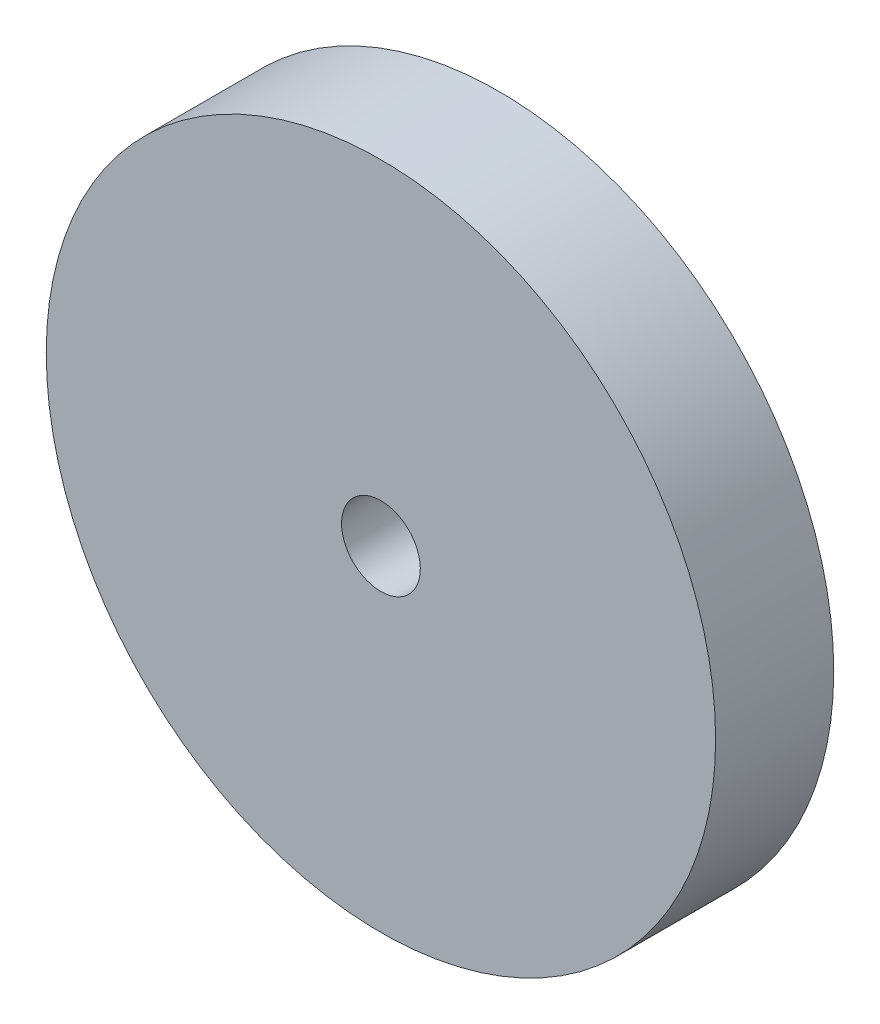
ISO-10303-21;
HEADER;
FILE_DESCRIPTION(('STEP AP214'),'2;1');
FILE_NAME('part.step','',(''),(''),'','','');
FILE_SCHEMA(('AUTOMOTIVE_DESIGN { 1 0 10303 214 1 1 1 1 }'));
ENDSEC;
DATA;
#1=APPLICATION_CONTEXT('core data for automotive mechanical design processes');
#2=APPLICATION_PROTOCOL_DEFINITION('international standard','automotive_design',2000,#1);
#3=PRODUCT_CONTEXT('',#1,'mechanical');
#4=PRODUCT('Part','Part','',(#3));
#5=PRODUCT_RELATED_PRODUCT_CATEGORY('part','',(#4));
#6=PRODUCT_DEFINITION_FORMATION('','',#4);
#7=PRODUCT_DEFINITION_CONTEXT('part definition',#1,'design');
#8=PRODUCT_DEFINITION('design','',#6,#7);
#9=PRODUCT_DEFINITION_SHAPE('','',#8);
#10=(LENGTH_UNIT() NAMED_UNIT(*) SI_UNIT(.MILLI.,.METRE.));
#11=(NAMED_UNIT(*) PLANE_ANGLE_UNIT() SI_UNIT($,.RADIAN.));
#12=(NAMED_UNIT(*) SI_UNIT($,.STERADIAN.) SOLID_ANGLE_UNIT());
#13=UNCERTAINTY_MEASURE_WITH_UNIT(LENGTH_MEASURE(1.E-05),#10,'distance_accuracy_value','');
#14=(GEOMETRIC_REPRESENTATION_CONTEXT(3) GLOBAL_UNCERTAINTY_ASSIGNED_CONTEXT((#13)) GLOBAL_UNIT_ASSIGNED_CONTEXT((#10,
#11,#12)) REPRESENTATION_CONTEXT('',''));
#15=CARTESIAN_POINT('',(0.,0.,0.));
#16=DIRECTION('',(0.,0.,1.));
#17=DIRECTION('',(1.,0.,0.));
#18=AXIS2_PLACEMENT_3D('',#15,#16,#17);
#19=CARTESIAN_POINT('',(0.,0.,3.));
#20=DIRECTION('',(0.,0.,-1.));
#21=DIRECTION('',(0.,-1.,0.));
#22=AXIS2_PLACEMENT_3D('',#19,#20,#21);
#23=CYLINDRICAL_SURFACE('',#22,1.);
#24=CARTESIAN_POINT('',(0.,0.,3.));
#25=DIRECTION('',(0.,0.,-1.));
#26=DIRECTION('',(0.,-1.,0.));
#27=AXIS2_PLACEMENT_3D('',#24,#25,#26);
#28=CIRCLE('',#27,1.);
#29=CARTESIAN_POINT('',(0.,-1.,3.));
#30=VERTEX_POINT('',#29);
#31=EDGE_CURVE('E25',#30,#30,#28,.T.);
#32=ORIENTED_EDGE('',*,*,#31,.F.);
#33=EDGE_LOOP('',(#32));
#34=FACE_BOUND('',#33,.T.);
#35=CARTESIAN_POINT('',(0.,0.,0.));
#36=DIRECTION('',(0.,0.,1.));
#37=DIRECTION('',(1.,0.,0.));
#38=AXIS2_PLACEMENT_3D('',#35,#36,#37);
#39=CIRCLE('',#38,1.);
#40=CARTESIAN_POINT('',(1.,0.,0.));
#41=VERTEX_POINT('',#40);
#42=EDGE_CURVE('E29',#41,#41,#39,.T.);
#43=ORIENTED_EDGE('',*,*,#42,.F.);
#44=EDGE_LOOP('',(#43));
#45=FACE_BOUND('',#44,.T.);
#46=ADVANCED_FACE('F14',(#34,#45),#23,.F.);
#47=CARTESIAN_POINT('',(0.,0.,3.));
#48=DIRECTION('',(0.,0.,-1.));
#49=DIRECTION('',(0.,-1.,0.));
#50=AXIS2_PLACEMENT_3D('',#47,#48,#49);
#51=CYLINDRICAL_SURFACE('',#50,8.5);
#52=CARTESIAN_POINT('',(0.,0.,3.));
#53=DIRECTION('',(0.,0.,1.));
#54=DIRECTION('',(1.,0.,0.));
#55=AXIS2_PLACEMENT_3D('',#52,#53,#54);
#56=CIRCLE('',#55,8.5);
#57=CARTESIAN_POINT('',(8.5,0.,3.));
#58=VERTEX_POINT('',#57);
#59=EDGE_CURVE('E21',#58,#58,#56,.T.);
#60=ORIENTED_EDGE('',*,*,#59,.F.);
#61=EDGE_LOOP('',(#60));
#62=FACE_BOUND('',#61,.T.);
#63=CARTESIAN_POINT('',(0.,0.,0.));
#64=DIRECTION('',(0.,0.,1.));
#65=DIRECTION('',(1.,0.,0.));
#66=AXIS2_PLACEMENT_3D('',#63,#64,#65);
#67=CIRCLE('',#66,8.5);
#68=CARTESIAN_POINT('',(8.5,0.,0.));
#69=VERTEX_POINT('',#68);
#70=EDGE_CURVE('E9',#69,#69,#67,.T.);
#71=ORIENTED_EDGE('',*,*,#70,.T.);
#72=EDGE_LOOP('',(#71));
#73=FACE_BOUND('',#72,.T.);
#74=ADVANCED_FACE('F16',(#62,#73),#51,.T.);
#75=CARTESIAN_POINT('',(0.,0.,3.));
#76=DIRECTION('',(0.,0.,1.));
#77=DIRECTION('',(1.,0.,0.));
#78=AXIS2_PLACEMENT_3D('',#75,#76,#77);
#79=PLANE('',#78);
#80=ORIENTED_EDGE('',*,*,#59,.T.);
#81=EDGE_LOOP('',(#80));
#82=FACE_BOUND('',#81,.T.);
#83=ORIENTED_EDGE('',*,*,#31,.T.);
#84=EDGE_LOOP('',(#83));
#85=FACE_BOUND('',#84,.T.);
#86=ADVANCED_FACE('F43',(#82,#85),#79,.T.);
#87=CARTESIAN_POINT('',(0.,0.,0.));
#88=DIRECTION('',(0.,0.,1.));
#89=DIRECTION('',(1.,0.,0.));
#90=AXIS2_PLACEMENT_3D('',#87,#88,#89);
#91=PLANE('',#90);
#92=ORIENTED_EDGE('',*,*,#70,.F.);
#93=EDGE_LOOP('',(#92));
#94=FACE_BOUND('',#93,.T.);
#95=ORIENTED_EDGE('',*,*,#42,.T.);
#96=EDGE_LOOP('',(#95));
#97=FACE_BOUND('',#96,.T.);
#98=ADVANCED_FACE('F35',(#94,#97),#91,.F.);
#99=CLOSED_SHELL('',(#46,#74,#86,#98));
#100=MANIFOLD_SOLID_BREP('B1',#99);
#101=ADVANCED_BREP_SHAPE_REPRESENTATION('',(#18,#100),#14);
#102=SHAPE_DEFINITION_REPRESENTATION(#9,#101);
ENDSEC;
END-ISO-10303-21;
